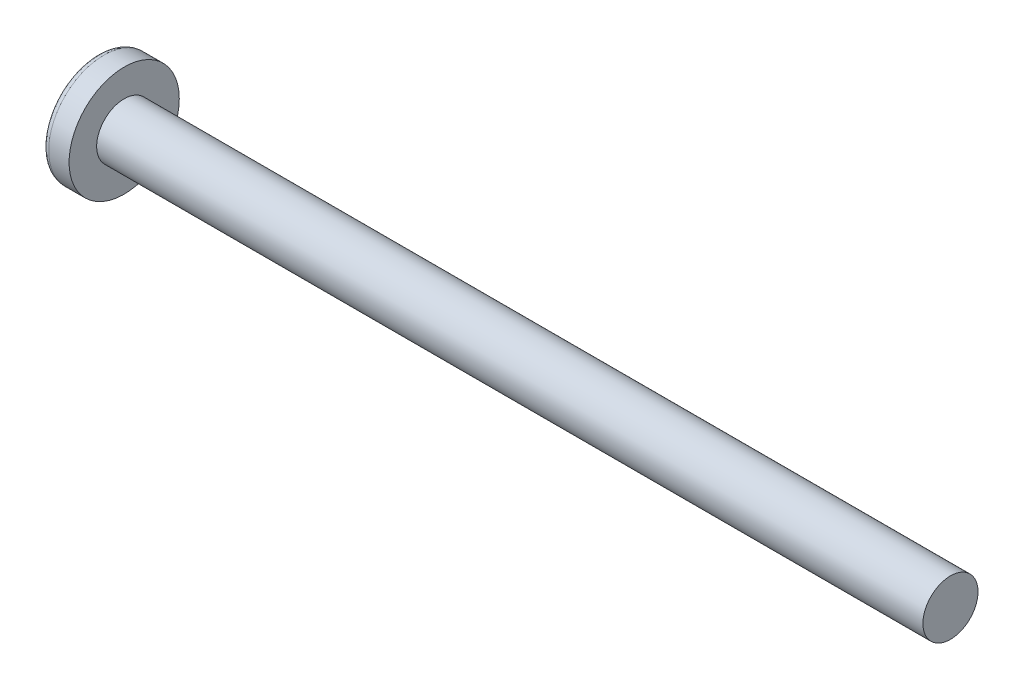
ISO-10303-21;
HEADER;
FILE_DESCRIPTION(('STEP AP214'),'2;1');
FILE_NAME('part.step','',(''),(''),'','','');
FILE_SCHEMA(('AUTOMOTIVE_DESIGN { 1 0 10303 214 1 1 1 1 }'));
ENDSEC;
DATA;
#1=APPLICATION_CONTEXT('core data for automotive mechanical design processes');
#2=APPLICATION_PROTOCOL_DEFINITION('international standard','automotive_design',2000,#1);
#3=PRODUCT_CONTEXT('',#1,'mechanical');
#4=PRODUCT('Part','Part','',(#3));
#5=PRODUCT_RELATED_PRODUCT_CATEGORY('part','',(#4));
#6=PRODUCT_DEFINITION_FORMATION('','',#4);
#7=PRODUCT_DEFINITION_CONTEXT('part definition',#1,'design');
#8=PRODUCT_DEFINITION('design','',#6,#7);
#9=PRODUCT_DEFINITION_SHAPE('','',#8);
#10=(LENGTH_UNIT() NAMED_UNIT(*) SI_UNIT(.MILLI.,.METRE.));
#11=(NAMED_UNIT(*) PLANE_ANGLE_UNIT() SI_UNIT($,.RADIAN.));
#12=(NAMED_UNIT(*) SI_UNIT($,.STERADIAN.) SOLID_ANGLE_UNIT());
#13=UNCERTAINTY_MEASURE_WITH_UNIT(LENGTH_MEASURE(1.E-05),#10,'distance_accuracy_value','');
#14=(GEOMETRIC_REPRESENTATION_CONTEXT(3) GLOBAL_UNCERTAINTY_ASSIGNED_CONTEXT((#13)) GLOBAL_UNIT_ASSIGNED_CONTEXT((#10,
#11,#12)) REPRESENTATION_CONTEXT('',''));
#15=CARTESIAN_POINT('',(0.,0.,0.));
#16=DIRECTION('',(0.,0.,1.));
#17=DIRECTION('',(1.,0.,0.));
#18=AXIS2_PLACEMENT_3D('',#15,#16,#17);
#19=CARTESIAN_POINT('',(6.5,0.,0.));
#20=DIRECTION('',(1.,0.,0.));
#21=DIRECTION('',(0.,1.,0.));
#22=AXIS2_PLACEMENT_3D('',#19,#20,#21);
#23=SPHERICAL_SURFACE('',#22,6.5);
#24=CARTESIAN_POINT('',(1.22696010591455,0.,0.));
#25=DIRECTION('',(1.,0.,0.));
#26=DIRECTION('',(0.,0.,-1.));
#27=AXIS2_PLACEMENT_3D('',#24,#25,#26);
#28=CIRCLE('',#27,3.80066445182724);
#29=CARTESIAN_POINT('',(1.22696010591455,0.,-3.80066445182724));
#30=VERTEX_POINT('',#29);
#31=EDGE_CURVE('E140',#30,#30,#28,.T.);
#32=ORIENTED_EDGE('',*,*,#31,.F.);
#33=EDGE_LOOP('',(#32));
#34=FACE_BOUND('',#33,.T.);
#35=CARTESIAN_POINT('',(6.5,0.,-0.5));
#36=DIRECTION('',(0.,0.,1.));
#37=DIRECTION('',(0.,-1.,0.));
#38=AXIS2_PLACEMENT_3D('',#35,#36,#37);
#39=CIRCLE('',#38,6.48074069840786);
#40=CARTESIAN_POINT('',(0.315341561573508,-1.93649167310371,-0.5));
#41=VERTEX_POINT('',#40);
#42=CARTESIAN_POINT('',(0.0385760083399574,-0.5,-0.5));
#43=VERTEX_POINT('',#42);
#44=EDGE_CURVE('E157',#41,#43,#39,.F.);
#45=ORIENTED_EDGE('',*,*,#44,.T.);
#46=CARTESIAN_POINT('',(6.5,-0.5,0.));
#47=DIRECTION('',(0.,1.,0.));
#48=DIRECTION('',(0.,0.,1.));
#49=AXIS2_PLACEMENT_3D('',#46,#47,#48);
#50=CIRCLE('',#49,6.48074069840786);
#51=CARTESIAN_POINT('',(0.315341561573508,-0.5,-1.93649167310371));
#52=VERTEX_POINT('',#51);
#53=EDGE_CURVE('E11',#43,#52,#50,.F.);
#54=ORIENTED_EDGE('',*,*,#53,.T.);
#55=CARTESIAN_POINT('',(6.5,0.,-1.93649167310371));
#56=DIRECTION('',(0.,0.,1.));
#57=DIRECTION('',(1.,0.,0.));
#58=AXIS2_PLACEMENT_3D('',#55,#56,#57);
#59=CIRCLE('',#58,6.20483682299543);
#60=CARTESIAN_POINT('',(0.315341561573509,0.5,-1.93649167310371));
#61=VERTEX_POINT('',#60);
#62=EDGE_CURVE('E40',#52,#61,#59,.F.);
#63=ORIENTED_EDGE('',*,*,#62,.T.);
#64=CARTESIAN_POINT('',(6.5,0.5,0.));
#65=DIRECTION('',(0.,-1.,0.));
#66=DIRECTION('',(0.,0.,-1.));
#67=AXIS2_PLACEMENT_3D('',#64,#65,#66);
#68=CIRCLE('',#67,6.48074069840786);
#69=CARTESIAN_POINT('',(0.0385760083399574,0.5,-0.5));
#70=VERTEX_POINT('',#69);
#71=EDGE_CURVE('E184',#61,#70,#68,.F.);
#72=ORIENTED_EDGE('',*,*,#71,.T.);
#73=CARTESIAN_POINT('',(6.5,0.,-0.5));
#74=DIRECTION('',(0.,0.,1.));
#75=DIRECTION('',(0.,-1.,0.));
#76=AXIS2_PLACEMENT_3D('',#73,#74,#75);
#77=CIRCLE('',#76,6.48074069840786);
#78=CARTESIAN_POINT('',(0.315341561573511,1.93649167310371,-0.5));
#79=VERTEX_POINT('',#78);
#80=EDGE_CURVE('E181',#70,#79,#77,.F.);
#81=ORIENTED_EDGE('',*,*,#80,.T.);
#82=CARTESIAN_POINT('',(6.5,1.93649167310371,0.));
#83=DIRECTION('',(0.,-1.,0.));
#84=DIRECTION('',(0.,0.,-1.));
#85=AXIS2_PLACEMENT_3D('',#82,#83,#84);
#86=CIRCLE('',#85,6.20483682299542);
#87=CARTESIAN_POINT('',(0.315341561573511,1.93649167310371,0.5));
#88=VERTEX_POINT('',#87);
#89=EDGE_CURVE('E178',#79,#88,#86,.F.);
#90=ORIENTED_EDGE('',*,*,#89,.T.);
#91=CARTESIAN_POINT('',(6.5,0.,0.5));
#92=DIRECTION('',(0.,0.,-1.));
#93=DIRECTION('',(0.,1.,0.));
#94=AXIS2_PLACEMENT_3D('',#91,#92,#93);
#95=CIRCLE('',#94,6.48074069840786);
#96=CARTESIAN_POINT('',(0.0385760083399574,0.5,0.5));
#97=VERTEX_POINT('',#96);
#98=EDGE_CURVE('E175',#88,#97,#95,.F.);
#99=ORIENTED_EDGE('',*,*,#98,.T.);
#100=CARTESIAN_POINT('',(6.5,0.5,0.));
#101=DIRECTION('',(0.,-1.,0.));
#102=DIRECTION('',(0.,0.,-1.));
#103=AXIS2_PLACEMENT_3D('',#100,#101,#102);
#104=CIRCLE('',#103,6.48074069840786);
#105=CARTESIAN_POINT('',(0.315341561573509,0.5,1.93649167310371));
#106=VERTEX_POINT('',#105);
#107=EDGE_CURVE('E172',#97,#106,#104,.F.);
#108=ORIENTED_EDGE('',*,*,#107,.T.);
#109=CARTESIAN_POINT('',(6.5,0.,1.93649167310371));
#110=DIRECTION('',(0.,0.,-1.));
#111=DIRECTION('',(-1.,0.,0.));
#112=AXIS2_PLACEMENT_3D('',#109,#110,#111);
#113=CIRCLE('',#112,6.20483682299543);
#114=CARTESIAN_POINT('',(0.315341561573509,-0.5,1.93649167310371));
#115=VERTEX_POINT('',#114);
#116=EDGE_CURVE('E169',#106,#115,#113,.F.);
#117=ORIENTED_EDGE('',*,*,#116,.T.);
#118=CARTESIAN_POINT('',(6.5,-0.5,0.));
#119=DIRECTION('',(0.,1.,0.));
#120=DIRECTION('',(0.,0.,1.));
#121=AXIS2_PLACEMENT_3D('',#118,#119,#120);
#122=CIRCLE('',#121,6.48074069840786);
#123=CARTESIAN_POINT('',(0.0385760083399566,-0.5,0.5));
#124=VERTEX_POINT('',#123);
#125=EDGE_CURVE('E166',#115,#124,#122,.F.);
#126=ORIENTED_EDGE('',*,*,#125,.T.);
#127=CARTESIAN_POINT('',(6.5,0.,0.5));
#128=DIRECTION('',(0.,0.,-1.));
#129=DIRECTION('',(0.,1.,0.));
#130=AXIS2_PLACEMENT_3D('',#127,#128,#129);
#131=CIRCLE('',#130,6.48074069840786);
#132=CARTESIAN_POINT('',(0.315341561573508,-1.93649167310371,0.5));
#133=VERTEX_POINT('',#132);
#134=EDGE_CURVE('E163',#124,#133,#131,.F.);
#135=ORIENTED_EDGE('',*,*,#134,.T.);
#136=CARTESIAN_POINT('',(6.5,-1.93649167310371,0.));
#137=DIRECTION('',(0.,1.,0.));
#138=DIRECTION('',(0.,0.,1.));
#139=AXIS2_PLACEMENT_3D('',#136,#137,#138);
#140=CIRCLE('',#139,6.20483682299543);
#141=EDGE_CURVE('E160',#133,#41,#140,.F.);
#142=ORIENTED_EDGE('',*,*,#141,.T.);
#143=EDGE_LOOP('',(#45,#54,#63,#72,#81,#90,#99,#108,#117,#126,#135,#142));
#144=FACE_BOUND('',#143,.T.);
#145=ADVANCED_FACE('F32',(#34,#144),#23,.T.);
#146=CARTESIAN_POINT('',(63.1,0.,0.));
#147=DIRECTION('',(1.,0.,0.));
#148=DIRECTION('',(0.,0.,-1.));
#149=AXIS2_PLACEMENT_3D('',#146,#147,#148);
#150=CYLINDRICAL_SURFACE('',#149,2.);
#151=CARTESIAN_POINT('',(3.1,0.,0.));
#152=DIRECTION('',(1.,0.,0.));
#153=DIRECTION('',(0.,0.,-1.));
#154=AXIS2_PLACEMENT_3D('',#151,#152,#153);
#155=CIRCLE('',#154,2.);
#156=CARTESIAN_POINT('',(3.1,0.,-2.));
#157=VERTEX_POINT('',#156);
#158=EDGE_CURVE('E154',#157,#157,#155,.T.);
#159=ORIENTED_EDGE('',*,*,#158,.T.);
#160=EDGE_LOOP('',(#159));
#161=FACE_BOUND('',#160,.T.);
#162=CARTESIAN_POINT('',(63.1,0.,0.));
#163=DIRECTION('',(1.,0.,0.));
#164=DIRECTION('',(0.,0.,-1.));
#165=AXIS2_PLACEMENT_3D('',#162,#163,#164);
#166=CIRCLE('',#165,2.);
#167=CARTESIAN_POINT('',(63.1,0.,-2.));
#168=VERTEX_POINT('',#167);
#169=EDGE_CURVE('E136',#168,#168,#166,.T.);
#170=ORIENTED_EDGE('',*,*,#169,.F.);
#171=EDGE_LOOP('',(#170));
#172=FACE_BOUND('',#171,.T.);
#173=ADVANCED_FACE('F34',(#161,#172),#150,.T.);
#174=CARTESIAN_POINT('',(3.1,2.,0.));
#175=DIRECTION('',(1.,0.,0.));
#176=DIRECTION('',(0.,0.,-1.));
#177=AXIS2_PLACEMENT_3D('',#174,#175,#176);
#178=PLANE('',#177);
#179=CARTESIAN_POINT('',(3.1,0.,0.));
#180=DIRECTION('',(1.,0.,0.));
#181=DIRECTION('',(0.,0.,-1.));
#182=AXIS2_PLACEMENT_3D('',#179,#180,#181);
#183=CIRCLE('',#182,4.);
#184=CARTESIAN_POINT('',(3.1,0.,-4.));
#185=VERTEX_POINT('',#184);
#186=EDGE_CURVE('E151',#185,#185,#183,.T.);
#187=ORIENTED_EDGE('',*,*,#186,.T.);
#188=EDGE_LOOP('',(#187));
#189=FACE_BOUND('',#188,.T.);
#190=ORIENTED_EDGE('',*,*,#158,.F.);
#191=EDGE_LOOP('',(#190));
#192=FACE_BOUND('',#191,.T.);
#193=ADVANCED_FACE('F281',(#189,#192),#178,.T.);
#194=CARTESIAN_POINT('',(63.1,0.,0.));
#195=DIRECTION('',(1.,0.,0.));
#196=DIRECTION('',(0.,0.,-1.));
#197=AXIS2_PLACEMENT_3D('',#194,#195,#196);
#198=CYLINDRICAL_SURFACE('',#197,4.);
#199=CARTESIAN_POINT('',(1.61635382117009,0.,0.));
#200=DIRECTION('',(1.,0.,0.));
#201=DIRECTION('',(0.,0.,-1.));
#202=AXIS2_PLACEMENT_3D('',#199,#200,#201);
#203=CIRCLE('',#202,4.);
#204=CARTESIAN_POINT('',(1.61635382117009,0.,-4.));
#205=VERTEX_POINT('',#204);
#206=EDGE_CURVE('E148',#205,#205,#203,.T.);
#207=ORIENTED_EDGE('',*,*,#206,.T.);
#208=EDGE_LOOP('',(#207));
#209=FACE_BOUND('',#208,.T.);
#210=ORIENTED_EDGE('',*,*,#186,.F.);
#211=EDGE_LOOP('',(#210));
#212=FACE_BOUND('',#211,.T.);
#213=ADVANCED_FACE('F291',(#209,#212),#198,.T.);
#214=CARTESIAN_POINT('',(1.61635382117009,0.,0.));
#215=DIRECTION('',(1.,0.,0.));
#216=DIRECTION('',(0.,0.,-1.));
#217=AXIS2_PLACEMENT_3D('',#214,#215,#216);
#218=TOROIDAL_SURFACE('',#217,3.52,0.480000000000001);
#219=ORIENTED_EDGE('',*,*,#31,.T.);
#220=EDGE_LOOP('',(#219));
#221=FACE_BOUND('',#220,.T.);
#222=ORIENTED_EDGE('',*,*,#206,.F.);
#223=EDGE_LOOP('',(#222));
#224=FACE_BOUND('',#223,.T.);
#225=ADVANCED_FACE('F288',(#221,#224),#218,.T.);
#226=CARTESIAN_POINT('',(63.1,2.,0.));
#227=DIRECTION('',(1.,0.,0.));
#228=DIRECTION('',(0.,0.,-1.));
#229=AXIS2_PLACEMENT_3D('',#226,#227,#228);
#230=PLANE('',#229);
#231=ORIENTED_EDGE('',*,*,#169,.T.);
#232=EDGE_LOOP('',(#231));
#233=FACE_BOUND('',#232,.T.);
#234=ADVANCED_FACE('F286',(#233),#230,.T.);
#235=CARTESIAN_POINT('',(2.5,-0.5,-0.5));
#236=DIRECTION('',(0.,1.,0.));
#237=DIRECTION('',(0.,0.,1.));
#238=AXIS2_PLACEMENT_3D('',#235,#236,#237);
#239=PLANE('',#238);
#240=DIRECTION('',(-1.,0.,0.));
#241=VECTOR('',#240,1.);
#242=CARTESIAN_POINT('',(2.5,-0.5,-0.5));
#243=LINE('',#242,#241);
#244=CARTESIAN_POINT('',(2.5,-0.5,-0.5));
#245=VERTEX_POINT('',#244);
#246=EDGE_CURVE('E47',#245,#43,#243,.T.);
#247=ORIENTED_EDGE('',*,*,#246,.F.);
#248=DIRECTION('',(0.,0.,-1.));
#249=VECTOR('',#248,1.);
#250=CARTESIAN_POINT('',(2.5,-0.5,-0.5));
#251=LINE('',#250,#249);
#252=CARTESIAN_POINT('',(2.5,-0.5,-1.93649167310371));
#253=VERTEX_POINT('',#252);
#254=EDGE_CURVE('E126',#245,#253,#251,.T.);
#255=ORIENTED_EDGE('',*,*,#254,.T.);
#256=DIRECTION('',(-1.,0.,0.));
#257=VECTOR('',#256,1.);
#258=CARTESIAN_POINT('',(2.5,-0.5,-1.93649167310371));
#259=LINE('',#258,#257);
#260=EDGE_CURVE('E133',#253,#52,#259,.T.);
#261=ORIENTED_EDGE('',*,*,#260,.T.);
#262=ORIENTED_EDGE('',*,*,#53,.F.);
#263=EDGE_LOOP('',(#247,#255,#261,#262));
#264=FACE_BOUND('',#263,.T.);
#265=ADVANCED_FACE('F132',(#264),#239,.T.);
#266=CARTESIAN_POINT('',(2.5,0.5,-1.93649167310371));
#267=DIRECTION('',(0.,0.,1.));
#268=DIRECTION('',(1.,0.,0.));
#269=AXIS2_PLACEMENT_3D('',#266,#267,#268);
#270=PLANE('',#269);
#271=ORIENTED_EDGE('',*,*,#260,.F.);
#272=DIRECTION('',(0.,1.,0.));
#273=VECTOR('',#272,1.);
#274=CARTESIAN_POINT('',(2.5,0.5,-1.93649167310371));
#275=LINE('',#274,#273);
#276=CARTESIAN_POINT('',(2.5,0.5,-1.93649167310371));
#277=VERTEX_POINT('',#276);
#278=EDGE_CURVE('E122',#253,#277,#275,.T.);
#279=ORIENTED_EDGE('',*,*,#278,.T.);
#280=DIRECTION('',(-1.,0.,0.));
#281=VECTOR('',#280,1.);
#282=CARTESIAN_POINT('',(2.5,0.5,-1.93649167310371));
#283=LINE('',#282,#281);
#284=EDGE_CURVE('E137',#277,#61,#283,.T.);
#285=ORIENTED_EDGE('',*,*,#284,.T.);
#286=ORIENTED_EDGE('',*,*,#62,.F.);
#287=EDGE_LOOP('',(#271,#279,#285,#286));
#288=FACE_BOUND('',#287,.T.);
#289=ADVANCED_FACE('F135',(#288),#270,.T.);
#290=CARTESIAN_POINT('',(2.5,0.5,-0.5));
#291=DIRECTION('',(0.,-1.,0.));
#292=DIRECTION('',(0.,0.,-1.));
#293=AXIS2_PLACEMENT_3D('',#290,#291,#292);
#294=PLANE('',#293);
#295=ORIENTED_EDGE('',*,*,#284,.F.);
#296=DIRECTION('',(0.,0.,1.));
#297=VECTOR('',#296,1.);
#298=CARTESIAN_POINT('',(2.5,0.5,-0.5));
#299=LINE('',#298,#297);
#300=CARTESIAN_POINT('',(2.5,0.5,-0.5));
#301=VERTEX_POINT('',#300);
#302=EDGE_CURVE('E128',#277,#301,#299,.T.);
#303=ORIENTED_EDGE('',*,*,#302,.T.);
#304=DIRECTION('',(-1.,0.,0.));
#305=VECTOR('',#304,1.);
#306=CARTESIAN_POINT('',(2.5,0.5,-0.5));
#307=LINE('',#306,#305);
#308=EDGE_CURVE('E142',#301,#70,#307,.T.);
#309=ORIENTED_EDGE('',*,*,#308,.T.);
#310=ORIENTED_EDGE('',*,*,#71,.F.);
#311=EDGE_LOOP('',(#295,#303,#309,#310));
#312=FACE_BOUND('',#311,.T.);
#313=ADVANCED_FACE('F224',(#312),#294,.T.);
#314=CARTESIAN_POINT('',(2.5,1.93649167310371,-0.5));
#315=DIRECTION('',(0.,0.,1.));
#316=DIRECTION('',(0.,-1.,0.));
#317=AXIS2_PLACEMENT_3D('',#314,#315,#316);
#318=PLANE('',#317);
#319=ORIENTED_EDGE('',*,*,#308,.F.);
#320=DIRECTION('',(0.,1.,0.));
#321=VECTOR('',#320,1.);
#322=CARTESIAN_POINT('',(2.5,1.93649167310371,-0.5));
#323=LINE('',#322,#321);
#324=CARTESIAN_POINT('',(2.5,1.93649167310371,-0.5));
#325=VERTEX_POINT('',#324);
#326=EDGE_CURVE('E227',#301,#325,#323,.T.);
#327=ORIENTED_EDGE('',*,*,#326,.T.);
#328=DIRECTION('',(-1.,0.,0.));
#329=VECTOR('',#328,1.);
#330=CARTESIAN_POINT('',(2.5,1.93649167310371,-0.5));
#331=LINE('',#330,#329);
#332=EDGE_CURVE('E219',#325,#79,#331,.T.);
#333=ORIENTED_EDGE('',*,*,#332,.T.);
#334=ORIENTED_EDGE('',*,*,#80,.F.);
#335=EDGE_LOOP('',(#319,#327,#333,#334));
#336=FACE_BOUND('',#335,.T.);
#337=ADVANCED_FACE('F226',(#336),#318,.T.);
#338=CARTESIAN_POINT('',(2.5,1.93649167310371,0.5));
#339=DIRECTION('',(0.,-1.,0.));
#340=DIRECTION('',(0.,0.,-1.));
#341=AXIS2_PLACEMENT_3D('',#338,#339,#340);
#342=PLANE('',#341);
#343=ORIENTED_EDGE('',*,*,#332,.F.);
#344=DIRECTION('',(0.,0.,1.));
#345=VECTOR('',#344,1.);
#346=CARTESIAN_POINT('',(2.5,1.93649167310371,0.5));
#347=LINE('',#346,#345);
#348=CARTESIAN_POINT('',(2.5,1.93649167310371,0.5));
#349=VERTEX_POINT('',#348);
#350=EDGE_CURVE('E231',#325,#349,#347,.T.);
#351=ORIENTED_EDGE('',*,*,#350,.T.);
#352=DIRECTION('',(-1.,0.,0.));
#353=VECTOR('',#352,1.);
#354=CARTESIAN_POINT('',(2.5,1.93649167310371,0.5));
#355=LINE('',#354,#353);
#356=EDGE_CURVE('E216',#349,#88,#355,.T.);
#357=ORIENTED_EDGE('',*,*,#356,.T.);
#358=ORIENTED_EDGE('',*,*,#89,.F.);
#359=EDGE_LOOP('',(#343,#351,#357,#358));
#360=FACE_BOUND('',#359,.T.);
#361=ADVANCED_FACE('F266',(#360),#342,.T.);
#362=CARTESIAN_POINT('',(2.5,1.93649167310371,0.5));
#363=DIRECTION('',(0.,0.,-1.));
#364=DIRECTION('',(0.,1.,0.));
#365=AXIS2_PLACEMENT_3D('',#362,#363,#364);
#366=PLANE('',#365);
#367=ORIENTED_EDGE('',*,*,#356,.F.);
#368=DIRECTION('',(0.,-1.,0.));
#369=VECTOR('',#368,1.);
#370=CARTESIAN_POINT('',(2.5,1.93649167310371,0.5));
#371=LINE('',#370,#369);
#372=CARTESIAN_POINT('',(2.5,0.5,0.5));
#373=VERTEX_POINT('',#372);
#374=EDGE_CURVE('E233',#349,#373,#371,.T.);
#375=ORIENTED_EDGE('',*,*,#374,.T.);
#376=DIRECTION('',(-1.,0.,0.));
#377=VECTOR('',#376,1.);
#378=CARTESIAN_POINT('',(2.5,0.5,0.5));
#379=LINE('',#378,#377);
#380=EDGE_CURVE('E213',#373,#97,#379,.T.);
#381=ORIENTED_EDGE('',*,*,#380,.T.);
#382=ORIENTED_EDGE('',*,*,#98,.F.);
#383=EDGE_LOOP('',(#367,#375,#381,#382));
#384=FACE_BOUND('',#383,.T.);
#385=ADVANCED_FACE('F264',(#384),#366,.T.);
#386=CARTESIAN_POINT('',(2.5,0.5,1.93649167310371));
#387=DIRECTION('',(0.,-1.,0.));
#388=DIRECTION('',(0.,0.,-1.));
#389=AXIS2_PLACEMENT_3D('',#386,#387,#388);
#390=PLANE('',#389);
#391=ORIENTED_EDGE('',*,*,#380,.F.);
#392=DIRECTION('',(0.,0.,1.));
#393=VECTOR('',#392,1.);
#394=CARTESIAN_POINT('',(2.5,0.5,1.93649167310371));
#395=LINE('',#394,#393);
#396=CARTESIAN_POINT('',(2.5,0.5,1.93649167310371));
#397=VERTEX_POINT('',#396);
#398=EDGE_CURVE('E238',#373,#397,#395,.T.);
#399=ORIENTED_EDGE('',*,*,#398,.T.);
#400=DIRECTION('',(-1.,0.,0.));
#401=VECTOR('',#400,1.);
#402=CARTESIAN_POINT('',(2.5,0.5,1.93649167310371));
#403=LINE('',#402,#401);
#404=EDGE_CURVE('E210',#397,#106,#403,.T.);
#405=ORIENTED_EDGE('',*,*,#404,.T.);
#406=ORIENTED_EDGE('',*,*,#107,.F.);
#407=EDGE_LOOP('',(#391,#399,#405,#406));
#408=FACE_BOUND('',#407,.T.);
#409=ADVANCED_FACE('F260',(#408),#390,.T.);
#410=CARTESIAN_POINT('',(2.5,0.5,1.93649167310371));
#411=DIRECTION('',(0.,0.,-1.));
#412=DIRECTION('',(-1.,0.,0.));
#413=AXIS2_PLACEMENT_3D('',#410,#411,#412);
#414=PLANE('',#413);
#415=ORIENTED_EDGE('',*,*,#404,.F.);
#416=DIRECTION('',(0.,-1.,0.));
#417=VECTOR('',#416,1.);
#418=CARTESIAN_POINT('',(2.5,0.5,1.93649167310371));
#419=LINE('',#418,#417);
#420=CARTESIAN_POINT('',(2.5,-0.5,1.93649167310371));
#421=VERTEX_POINT('',#420);
#422=EDGE_CURVE('E240',#397,#421,#419,.T.);
#423=ORIENTED_EDGE('',*,*,#422,.T.);
#424=DIRECTION('',(-1.,0.,0.));
#425=VECTOR('',#424,1.);
#426=CARTESIAN_POINT('',(2.5,-0.5,1.93649167310371));
#427=LINE('',#426,#425);
#428=EDGE_CURVE('E207',#421,#115,#427,.T.);
#429=ORIENTED_EDGE('',*,*,#428,.T.);
#430=ORIENTED_EDGE('',*,*,#116,.F.);
#431=EDGE_LOOP('',(#415,#423,#429,#430));
#432=FACE_BOUND('',#431,.T.);
#433=ADVANCED_FACE('F257',(#432),#414,.T.);
#434=CARTESIAN_POINT('',(2.5,-0.5,1.93649167310371));
#435=DIRECTION('',(0.,1.,0.));
#436=DIRECTION('',(0.,0.,1.));
#437=AXIS2_PLACEMENT_3D('',#434,#435,#436);
#438=PLANE('',#437);
#439=ORIENTED_EDGE('',*,*,#428,.F.);
#440=DIRECTION('',(0.,0.,-1.));
#441=VECTOR('',#440,1.);
#442=CARTESIAN_POINT('',(2.5,-0.5,1.93649167310371));
#443=LINE('',#442,#441);
#444=CARTESIAN_POINT('',(2.5,-0.5,0.5));
#445=VERTEX_POINT('',#444);
#446=EDGE_CURVE('E242',#421,#445,#443,.T.);
#447=ORIENTED_EDGE('',*,*,#446,.T.);
#448=DIRECTION('',(-1.,0.,0.));
#449=VECTOR('',#448,1.);
#450=CARTESIAN_POINT('',(2.5,-0.5,0.5));
#451=LINE('',#450,#449);
#452=EDGE_CURVE('E199',#445,#124,#451,.T.);
#453=ORIENTED_EDGE('',*,*,#452,.T.);
#454=ORIENTED_EDGE('',*,*,#125,.F.);
#455=EDGE_LOOP('',(#439,#447,#453,#454));
#456=FACE_BOUND('',#455,.T.);
#457=ADVANCED_FACE('F254',(#456),#438,.T.);
#458=CARTESIAN_POINT('',(2.5,-0.5,0.5));
#459=DIRECTION('',(0.,0.,-1.));
#460=DIRECTION('',(0.,1.,0.));
#461=AXIS2_PLACEMENT_3D('',#458,#459,#460);
#462=PLANE('',#461);
#463=ORIENTED_EDGE('',*,*,#452,.F.);
#464=DIRECTION('',(0.,-1.,0.));
#465=VECTOR('',#464,1.);
#466=CARTESIAN_POINT('',(2.5,-0.5,0.5));
#467=LINE('',#466,#465);
#468=CARTESIAN_POINT('',(2.5,-1.93649167310371,0.5));
#469=VERTEX_POINT('',#468);
#470=EDGE_CURVE('E244',#445,#469,#467,.T.);
#471=ORIENTED_EDGE('',*,*,#470,.T.);
#472=DIRECTION('',(-1.,0.,0.));
#473=VECTOR('',#472,1.);
#474=CARTESIAN_POINT('',(2.5,-1.93649167310371,0.5));
#475=LINE('',#474,#473);
#476=EDGE_CURVE('E197',#469,#133,#475,.T.);
#477=ORIENTED_EDGE('',*,*,#476,.T.);
#478=ORIENTED_EDGE('',*,*,#134,.F.);
#479=EDGE_LOOP('',(#463,#471,#477,#478));
#480=FACE_BOUND('',#479,.T.);
#481=ADVANCED_FACE('F251',(#480),#462,.T.);
#482=CARTESIAN_POINT('',(2.5,-1.93649167310371,0.5));
#483=DIRECTION('',(0.,1.,0.));
#484=DIRECTION('',(0.,0.,1.));
#485=AXIS2_PLACEMENT_3D('',#482,#483,#484);
#486=PLANE('',#485);
#487=ORIENTED_EDGE('',*,*,#476,.F.);
#488=DIRECTION('',(0.,0.,-1.));
#489=VECTOR('',#488,1.);
#490=CARTESIAN_POINT('',(2.5,-1.93649167310371,0.5));
#491=LINE('',#490,#489);
#492=CARTESIAN_POINT('',(2.5,-1.93649167310371,-0.5));
#493=VERTEX_POINT('',#492);
#494=EDGE_CURVE('E196',#469,#493,#491,.T.);
#495=ORIENTED_EDGE('',*,*,#494,.T.);
#496=DIRECTION('',(-1.,0.,0.));
#497=VECTOR('',#496,1.);
#498=CARTESIAN_POINT('',(2.5,-1.93649167310371,-0.5));
#499=LINE('',#498,#497);
#500=EDGE_CURVE('E190',#493,#41,#499,.T.);
#501=ORIENTED_EDGE('',*,*,#500,.T.);
#502=ORIENTED_EDGE('',*,*,#141,.F.);
#503=EDGE_LOOP('',(#487,#495,#501,#502));
#504=FACE_BOUND('',#503,.T.);
#505=ADVANCED_FACE('F193',(#504),#486,.T.);
#506=CARTESIAN_POINT('',(2.5,-0.5,-0.5));
#507=DIRECTION('',(0.,0.,1.));
#508=DIRECTION('',(0.,-1.,0.));
#509=AXIS2_PLACEMENT_3D('',#506,#507,#508);
#510=PLANE('',#509);
#511=ORIENTED_EDGE('',*,*,#500,.F.);
#512=DIRECTION('',(0.,1.,0.));
#513=VECTOR('',#512,1.);
#514=CARTESIAN_POINT('',(2.5,-0.5,-0.5));
#515=LINE('',#514,#513);
#516=EDGE_CURVE('E201',#493,#245,#515,.T.);
#517=ORIENTED_EDGE('',*,*,#516,.T.);
#518=ORIENTED_EDGE('',*,*,#246,.T.);
#519=ORIENTED_EDGE('',*,*,#44,.F.);
#520=EDGE_LOOP('',(#511,#517,#518,#519));
#521=FACE_BOUND('',#520,.T.);
#522=ADVANCED_FACE('F189',(#521),#510,.T.);
#523=CARTESIAN_POINT('',(2.5,0.,0.));
#524=DIRECTION('',(-1.,0.,0.));
#525=DIRECTION('',(0.,0.,1.));
#526=AXIS2_PLACEMENT_3D('',#523,#524,#525);
#527=PLANE('',#526);
#528=ORIENTED_EDGE('',*,*,#254,.F.);
#529=ORIENTED_EDGE('',*,*,#516,.F.);
#530=ORIENTED_EDGE('',*,*,#494,.F.);
#531=ORIENTED_EDGE('',*,*,#470,.F.);
#532=ORIENTED_EDGE('',*,*,#446,.F.);
#533=ORIENTED_EDGE('',*,*,#422,.F.);
#534=ORIENTED_EDGE('',*,*,#398,.F.);
#535=ORIENTED_EDGE('',*,*,#374,.F.);
#536=ORIENTED_EDGE('',*,*,#350,.F.);
#537=ORIENTED_EDGE('',*,*,#326,.F.);
#538=ORIENTED_EDGE('',*,*,#302,.F.);
#539=ORIENTED_EDGE('',*,*,#278,.F.);
#540=EDGE_LOOP('',(#528,#529,#530,#531,#532,#533,#534,#535,#536,#537,#538,#539));
#541=FACE_BOUND('',#540,.T.);
#542=ADVANCED_FACE('F124',(#541),#527,.T.);
#543=CLOSED_SHELL('',(#145,#173,#193,#213,#225,#234,#265,#289,#313,#337,#361,#385,#409,#433,
#457,#481,#505,#522,#542));
#544=MANIFOLD_SOLID_BREP('B2',#543);
#545=ADVANCED_BREP_SHAPE_REPRESENTATION('',(#18,#544),#14);
#546=SHAPE_DEFINITION_REPRESENTATION(#9,#545);
ENDSEC;
END-ISO-10303-21;
